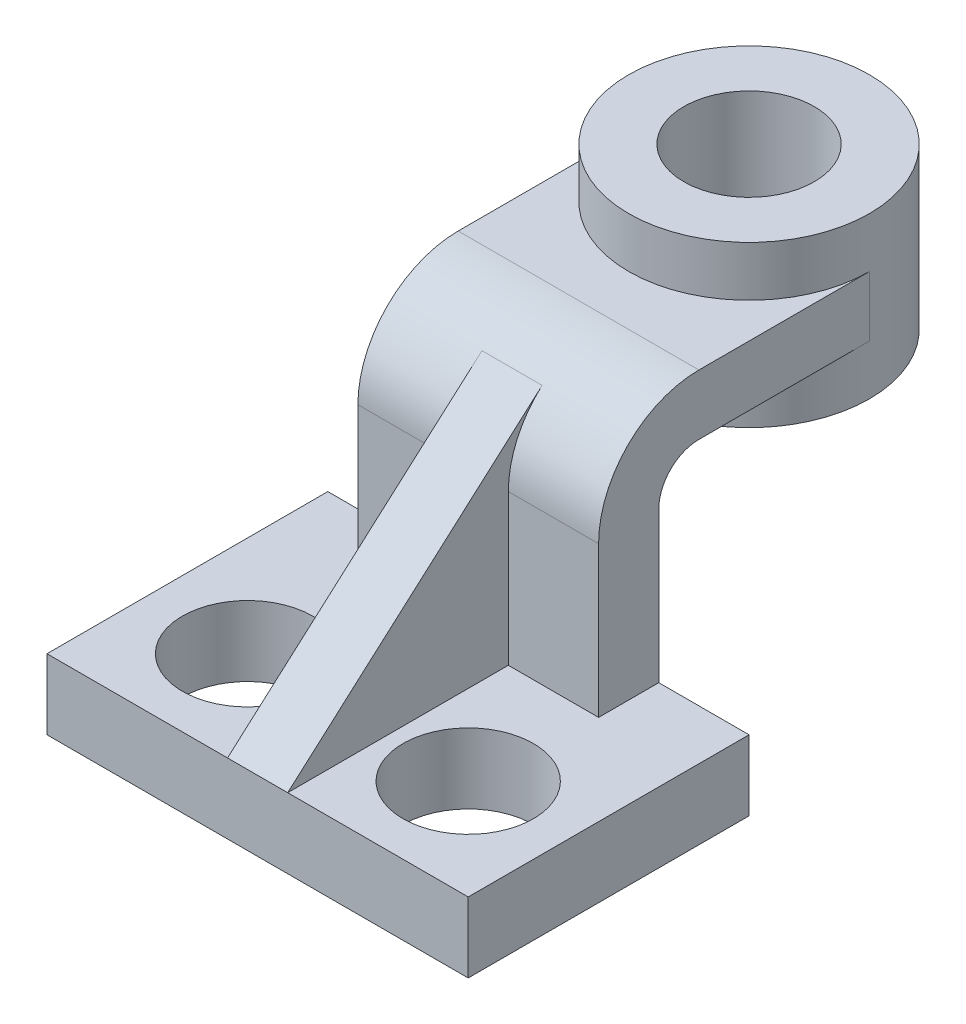
ISO-10303-21;
HEADER;
FILE_DESCRIPTION(('STEP AP214'),'2;1');
FILE_NAME('part.step','',(''),(''),'','','');
FILE_SCHEMA(('AUTOMOTIVE_DESIGN { 1 0 10303 214 1 1 1 1 }'));
ENDSEC;
DATA;
#1=APPLICATION_CONTEXT('core data for automotive mechanical design processes');
#2=APPLICATION_PROTOCOL_DEFINITION('international standard','automotive_design',2000,#1);
#3=PRODUCT_CONTEXT('',#1,'mechanical');
#4=PRODUCT('Part','Part','',(#3));
#5=PRODUCT_RELATED_PRODUCT_CATEGORY('part','',(#4));
#6=PRODUCT_DEFINITION_FORMATION('','',#4);
#7=PRODUCT_DEFINITION_CONTEXT('part definition',#1,'design');
#8=PRODUCT_DEFINITION('design','',#6,#7);
#9=PRODUCT_DEFINITION_SHAPE('','',#8);
#10=(LENGTH_UNIT() NAMED_UNIT(*) SI_UNIT(.MILLI.,.METRE.));
#11=(NAMED_UNIT(*) PLANE_ANGLE_UNIT() SI_UNIT($,.RADIAN.));
#12=(NAMED_UNIT(*) SI_UNIT($,.STERADIAN.) SOLID_ANGLE_UNIT());
#13=UNCERTAINTY_MEASURE_WITH_UNIT(LENGTH_MEASURE(1.E-05),#10,'distance_accuracy_value','');
#14=(GEOMETRIC_REPRESENTATION_CONTEXT(3) GLOBAL_UNCERTAINTY_ASSIGNED_CONTEXT((#13)) GLOBAL_UNIT_ASSIGNED_CONTEXT((#10,
#11,#12)) REPRESENTATION_CONTEXT('',''));
#15=CARTESIAN_POINT('',(0.,0.,0.));
#16=DIRECTION('',(0.,0.,1.));
#17=DIRECTION('',(1.,0.,0.));
#18=AXIS2_PLACEMENT_3D('',#15,#16,#17);
#19=CARTESIAN_POINT('',(-9.00000000000001,7.,-22.));
#20=DIRECTION('',(0.,0.,-1.));
#21=DIRECTION('',(-1.,0.,0.));
#22=AXIS2_PLACEMENT_3D('',#19,#20,#21);
#23=PLANE('',#22);
#24=DIRECTION('',(0.,-1.,0.));
#25=VECTOR('',#24,1.);
#26=CARTESIAN_POINT('',(-24.,7.,-22.));
#27=LINE('',#26,#25);
#28=CARTESIAN_POINT('',(-24.,21.9999999999999,-22.));
#29=VERTEX_POINT('',#28);
#30=CARTESIAN_POINT('',(-24.,7.,-22.));
#31=VERTEX_POINT('',#30);
#32=EDGE_CURVE('E63',#29,#31,#27,.T.);
#33=ORIENTED_EDGE('',*,*,#32,.F.);
#34=DIRECTION('',(-1.,0.,0.));
#35=VECTOR('',#34,1.);
#36=CARTESIAN_POINT('',(-9.00000000000001,21.9999999999999,-22.));
#37=LINE('',#36,#35);
#38=CARTESIAN_POINT('',(-33.,21.9999999999999,-22.));
#39=VERTEX_POINT('',#38);
#40=EDGE_CURVE('E136',#29,#39,#37,.T.);
#41=ORIENTED_EDGE('',*,*,#40,.T.);
#42=DIRECTION('',(0.,-1.,0.));
#43=VECTOR('',#42,1.);
#44=CARTESIAN_POINT('',(-33.,7.,-22.));
#45=LINE('',#44,#43);
#46=CARTESIAN_POINT('',(-33.,7.,-22.));
#47=VERTEX_POINT('',#46);
#48=EDGE_CURVE('E141',#39,#47,#45,.T.);
#49=ORIENTED_EDGE('',*,*,#48,.T.);
#50=DIRECTION('',(-1.,0.,0.));
#51=VECTOR('',#50,1.);
#52=CARTESIAN_POINT('',(-9.00000000000001,7.,-22.));
#53=LINE('',#52,#51);
#54=EDGE_CURVE('E187',#31,#47,#53,.T.);
#55=ORIENTED_EDGE('',*,*,#54,.F.);
#56=EDGE_LOOP('',(#33,#41,#49,#55));
#57=FACE_BOUND('',#56,.T.);
#58=ADVANCED_FACE('F45',(#57),#23,.F.);
#59=CARTESIAN_POINT('',(-42.,7.,0.));
#60=DIRECTION('',(0.,1.,0.));
#61=DIRECTION('',(0.,0.,1.));
#62=AXIS2_PLACEMENT_3D('',#59,#60,#61);
#63=PLANE('',#62);
#64=CARTESIAN_POINT('',(-32.,7.,-10.));
#65=DIRECTION('',(0.,1.,0.));
#66=DIRECTION('',(0.,0.,-1.));
#67=AXIS2_PLACEMENT_3D('',#64,#65,#66);
#68=CIRCLE('',#67,6.5);
#69=CARTESIAN_POINT('',(-32.,7.,-16.5));
#70=VERTEX_POINT('',#69);
#71=EDGE_CURVE('E314',#70,#70,#68,.T.);
#72=ORIENTED_EDGE('',*,*,#71,.F.);
#73=EDGE_LOOP('',(#72));
#74=FACE_BOUND('',#73,.T.);
#75=DIRECTION('',(1.,0.,0.));
#76=VECTOR('',#75,1.);
#77=CARTESIAN_POINT('',(-42.,7.,0.));
#78=LINE('',#77,#76);
#79=CARTESIAN_POINT('',(-42.,7.,0.));
#80=VERTEX_POINT('',#79);
#81=CARTESIAN_POINT('',(-24.,7.,0.));
#82=VERTEX_POINT('',#81);
#83=EDGE_CURVE('E231',#80,#82,#78,.T.);
#84=ORIENTED_EDGE('',*,*,#83,.T.);
#85=DIRECTION('',(0.,0.,-1.));
#86=VECTOR('',#85,1.);
#87=CARTESIAN_POINT('',(-24.,7.,-25.3670653506778));
#88=LINE('',#87,#86);
#89=EDGE_CURVE('E300',#82,#31,#88,.T.);
#90=ORIENTED_EDGE('',*,*,#89,.T.);
#91=ORIENTED_EDGE('',*,*,#54,.T.);
#92=DIRECTION('',(0.,0.,-1.));
#93=VECTOR('',#92,1.);
#94=CARTESIAN_POINT('',(-33.,7.,-28.));
#95=LINE('',#94,#93);
#96=CARTESIAN_POINT('',(-33.,7.,-28.));
#97=VERTEX_POINT('',#96);
#98=EDGE_CURVE('E145',#47,#97,#95,.T.);
#99=ORIENTED_EDGE('',*,*,#98,.T.);
#100=DIRECTION('',(1.,0.,0.));
#101=VECTOR('',#100,1.);
#102=CARTESIAN_POINT('',(-42.,7.,-28.));
#103=LINE('',#102,#101);
#104=CARTESIAN_POINT('',(-42.,7.,-28.));
#105=VERTEX_POINT('',#104);
#106=EDGE_CURVE('E235',#105,#97,#103,.T.);
#107=ORIENTED_EDGE('',*,*,#106,.F.);
#108=DIRECTION('',(0.,0.,1.));
#109=VECTOR('',#108,1.);
#110=CARTESIAN_POINT('',(-42.,7.,0.));
#111=LINE('',#110,#109);
#112=EDGE_CURVE('E212',#105,#80,#111,.T.);
#113=ORIENTED_EDGE('',*,*,#112,.T.);
#114=EDGE_LOOP('',(#84,#90,#91,#99,#107,#113));
#115=FACE_BOUND('',#114,.T.);
#116=ADVANCED_FACE('F343',(#74,#115),#63,.T.);
#117=CARTESIAN_POINT('',(-42.,0.,0.));
#118=DIRECTION('',(0.,0.,1.));
#119=DIRECTION('',(1.,0.,0.));
#120=AXIS2_PLACEMENT_3D('',#117,#118,#119);
#121=PLANE('',#120);
#122=DIRECTION('',(0.,-1.,0.));
#123=VECTOR('',#122,1.);
#124=CARTESIAN_POINT('',(0.,0.,0.));
#125=LINE('',#124,#123);
#126=CARTESIAN_POINT('',(0.,7.,0.));
#127=VERTEX_POINT('',#126);
#128=CARTESIAN_POINT('',(0.,0.,0.));
#129=VERTEX_POINT('',#128);
#130=EDGE_CURVE('E198',#127,#129,#125,.T.);
#131=ORIENTED_EDGE('',*,*,#130,.F.);
#132=CARTESIAN_POINT('',(-18.,7.,0.));
#133=VERTEX_POINT('',#132);
#134=EDGE_CURVE('E236',#133,#127,#78,.T.);
#135=ORIENTED_EDGE('',*,*,#134,.F.);
#136=DIRECTION('',(-1.,0.,0.));
#137=VECTOR('',#136,1.);
#138=CARTESIAN_POINT('',(-18.,7.,0.));
#139=LINE('',#138,#137);
#140=EDGE_CURVE('E290',#133,#82,#139,.T.);
#141=ORIENTED_EDGE('',*,*,#140,.T.);
#142=ORIENTED_EDGE('',*,*,#83,.F.);
#143=DIRECTION('',(0.,-1.,0.));
#144=VECTOR('',#143,1.);
#145=CARTESIAN_POINT('',(-42.,0.,0.));
#146=LINE('',#145,#144);
#147=CARTESIAN_POINT('',(-42.,0.,0.));
#148=VERTEX_POINT('',#147);
#149=EDGE_CURVE('E199',#80,#148,#146,.T.);
#150=ORIENTED_EDGE('',*,*,#149,.T.);
#151=DIRECTION('',(1.,0.,0.));
#152=VECTOR('',#151,1.);
#153=CARTESIAN_POINT('',(-42.,0.,0.));
#154=LINE('',#153,#152);
#155=EDGE_CURVE('E216',#148,#129,#154,.T.);
#156=ORIENTED_EDGE('',*,*,#155,.T.);
#157=EDGE_LOOP('',(#131,#135,#141,#142,#150,#156));
#158=FACE_BOUND('',#157,.T.);
#159=ADVANCED_FACE('F360',(#158),#121,.T.);
#160=CARTESIAN_POINT('',(-42.,0.,0.));
#161=DIRECTION('',(-1.,0.,0.));
#162=DIRECTION('',(0.,0.,1.));
#163=AXIS2_PLACEMENT_3D('',#160,#161,#162);
#164=PLANE('',#163);
#165=ORIENTED_EDGE('',*,*,#149,.F.);
#166=ORIENTED_EDGE('',*,*,#112,.F.);
#167=DIRECTION('',(0.,1.,0.));
#168=VECTOR('',#167,1.);
#169=CARTESIAN_POINT('',(-42.,0.,-28.));
#170=LINE('',#169,#168);
#171=CARTESIAN_POINT('',(-42.,0.,-28.));
#172=VERTEX_POINT('',#171);
#173=EDGE_CURVE('E208',#172,#105,#170,.T.);
#174=ORIENTED_EDGE('',*,*,#173,.F.);
#175=DIRECTION('',(0.,0.,-1.));
#176=VECTOR('',#175,1.);
#177=CARTESIAN_POINT('',(-42.,0.,0.));
#178=LINE('',#177,#176);
#179=EDGE_CURVE('E204',#148,#172,#178,.T.);
#180=ORIENTED_EDGE('',*,*,#179,.F.);
#181=EDGE_LOOP('',(#165,#166,#174,#180));
#182=FACE_BOUND('',#181,.T.);
#183=ADVANCED_FACE('F412',(#182),#164,.T.);
#184=CARTESIAN_POINT('',(-42.,0.,0.));
#185=DIRECTION('',(0.,-1.,0.));
#186=DIRECTION('',(0.,0.,-1.));
#187=AXIS2_PLACEMENT_3D('',#184,#185,#186);
#188=PLANE('',#187);
#189=CARTESIAN_POINT('',(-10.,0.,-10.));
#190=DIRECTION('',(0.,1.,0.));
#191=DIRECTION('',(0.,0.,1.));
#192=AXIS2_PLACEMENT_3D('',#189,#190,#191);
#193=CIRCLE('',#192,6.5);
#194=CARTESIAN_POINT('',(-10.,0.,-3.50000000000001));
#195=VERTEX_POINT('',#194);
#196=EDGE_CURVE('E303',#195,#195,#193,.T.);
#197=ORIENTED_EDGE('',*,*,#196,.T.);
#198=EDGE_LOOP('',(#197));
#199=FACE_BOUND('',#198,.T.);
#200=CARTESIAN_POINT('',(-32.,0.,-10.));
#201=DIRECTION('',(0.,1.,0.));
#202=DIRECTION('',(0.,0.,-1.));
#203=AXIS2_PLACEMENT_3D('',#200,#201,#202);
#204=CIRCLE('',#203,6.5);
#205=CARTESIAN_POINT('',(-32.,0.,-16.5));
#206=VERTEX_POINT('',#205);
#207=EDGE_CURVE('E310',#206,#206,#204,.T.);
#208=ORIENTED_EDGE('',*,*,#207,.T.);
#209=EDGE_LOOP('',(#208));
#210=FACE_BOUND('',#209,.T.);
#211=DIRECTION('',(0.,0.,-1.));
#212=VECTOR('',#211,1.);
#213=CARTESIAN_POINT('',(0.,0.,0.));
#214=LINE('',#213,#212);
#215=CARTESIAN_POINT('',(0.,0.,-28.));
#216=VERTEX_POINT('',#215);
#217=EDGE_CURVE('E220',#129,#216,#214,.T.);
#218=ORIENTED_EDGE('',*,*,#217,.F.);
#219=ORIENTED_EDGE('',*,*,#155,.F.);
#220=ORIENTED_EDGE('',*,*,#179,.T.);
#221=DIRECTION('',(1.,0.,0.));
#222=VECTOR('',#221,1.);
#223=CARTESIAN_POINT('',(-42.,0.,-28.));
#224=LINE('',#223,#222);
#225=EDGE_CURVE('E240',#172,#216,#224,.T.);
#226=ORIENTED_EDGE('',*,*,#225,.T.);
#227=EDGE_LOOP('',(#218,#219,#220,#226));
#228=FACE_BOUND('',#227,.T.);
#229=ADVANCED_FACE('F326',(#199,#210,#228),#188,.T.);
#230=CARTESIAN_POINT('',(0.,0.,0.));
#231=DIRECTION('',(-1.,0.,0.));
#232=DIRECTION('',(0.,0.,1.));
#233=AXIS2_PLACEMENT_3D('',#230,#231,#232);
#234=PLANE('',#233);
#235=ORIENTED_EDGE('',*,*,#130,.T.);
#236=ORIENTED_EDGE('',*,*,#217,.T.);
#237=DIRECTION('',(0.,1.,0.));
#238=VECTOR('',#237,1.);
#239=CARTESIAN_POINT('',(0.,0.,-28.));
#240=LINE('',#239,#238);
#241=CARTESIAN_POINT('',(0.,7.,-28.));
#242=VERTEX_POINT('',#241);
#243=EDGE_CURVE('E224',#216,#242,#240,.T.);
#244=ORIENTED_EDGE('',*,*,#243,.T.);
#245=DIRECTION('',(0.,0.,1.));
#246=VECTOR('',#245,1.);
#247=CARTESIAN_POINT('',(0.,7.,0.));
#248=LINE('',#247,#246);
#249=EDGE_CURVE('E203',#242,#127,#248,.T.);
#250=ORIENTED_EDGE('',*,*,#249,.T.);
#251=EDGE_LOOP('',(#235,#236,#244,#250));
#252=FACE_BOUND('',#251,.T.);
#253=ADVANCED_FACE('F462',(#252),#234,.F.);
#254=CARTESIAN_POINT('',(-9.00000000000001,22.,-32.));
#255=DIRECTION('',(-1.,0.,0.));
#256=DIRECTION('',(0.,0.,1.));
#257=AXIS2_PLACEMENT_3D('',#254,#255,#256);
#258=CYLINDRICAL_SURFACE('',#257,4.);
#259=CARTESIAN_POINT('',(-33.,22.,-32.));
#260=DIRECTION('',(-1.,0.,0.));
#261=DIRECTION('',(0.,0.,1.));
#262=AXIS2_PLACEMENT_3D('',#259,#260,#261);
#263=CIRCLE('',#262,4.);
#264=CARTESIAN_POINT('',(-33.,22.,-28.));
#265=VERTEX_POINT('',#264);
#266=CARTESIAN_POINT('',(-33.,26.,-32.));
#267=VERTEX_POINT('',#266);
#268=EDGE_CURVE('E55',#265,#267,#263,.T.);
#269=ORIENTED_EDGE('',*,*,#268,.T.);
#270=DIRECTION('',(-1.,0.,0.));
#271=VECTOR('',#270,1.);
#272=CARTESIAN_POINT('',(-9.00000000000001,26.,-32.));
#273=LINE('',#272,#271);
#274=CARTESIAN_POINT('',(-9.00000000000001,26.,-32.));
#275=VERTEX_POINT('',#274);
#276=EDGE_CURVE('E137',#275,#267,#273,.T.);
#277=ORIENTED_EDGE('',*,*,#276,.F.);
#278=CARTESIAN_POINT('',(-9.00000000000001,22.,-32.));
#279=DIRECTION('',(-1.,0.,0.));
#280=DIRECTION('',(0.,0.,1.));
#281=AXIS2_PLACEMENT_3D('',#278,#279,#280);
#282=CIRCLE('',#281,4.);
#283=CARTESIAN_POINT('',(-9.00000000000001,22.,-28.));
#284=VERTEX_POINT('',#283);
#285=EDGE_CURVE('E97',#284,#275,#282,.T.);
#286=ORIENTED_EDGE('',*,*,#285,.F.);
#287=DIRECTION('',(-1.,0.,0.));
#288=VECTOR('',#287,1.);
#289=CARTESIAN_POINT('',(-9.00000000000001,22.,-28.));
#290=LINE('',#289,#288);
#291=EDGE_CURVE('E195',#284,#265,#290,.T.);
#292=ORIENTED_EDGE('',*,*,#291,.T.);
#293=EDGE_LOOP('',(#269,#277,#286,#292));
#294=FACE_BOUND('',#293,.T.);
#295=ADVANCED_FACE('F452',(#294),#258,.F.);
#296=CARTESIAN_POINT('',(-9.00000000000001,26.,-32.));
#297=DIRECTION('',(0.,1.,0.));
#298=DIRECTION('',(0.,0.,1.));
#299=AXIS2_PLACEMENT_3D('',#296,#297,#298);
#300=PLANE('',#299);
#301=DIRECTION('',(0.,0.,-1.));
#302=VECTOR('',#301,1.);
#303=CARTESIAN_POINT('',(-33.,26.,-32.));
#304=LINE('',#303,#302);
#305=CARTESIAN_POINT('',(-33.,26.,-49.));
#306=VERTEX_POINT('',#305);
#307=EDGE_CURVE('E124',#267,#306,#304,.T.);
#308=ORIENTED_EDGE('',*,*,#307,.T.);
#309=CARTESIAN_POINT('',(-21.,26.,-49.));
#310=DIRECTION('',(0.,1.,0.));
#311=DIRECTION('',(0.,0.,1.));
#312=AXIS2_PLACEMENT_3D('',#309,#310,#311);
#313=CIRCLE('',#312,12.);
#314=CARTESIAN_POINT('',(-9.00000000000001,26.,-49.));
#315=VERTEX_POINT('',#314);
#316=EDGE_CURVE('E249',#306,#315,#313,.T.);
#317=ORIENTED_EDGE('',*,*,#316,.T.);
#318=DIRECTION('',(0.,0.,-1.));
#319=VECTOR('',#318,1.);
#320=CARTESIAN_POINT('',(-9.00000000000001,26.,-32.));
#321=LINE('',#320,#319);
#322=EDGE_CURVE('E170',#275,#315,#321,.T.);
#323=ORIENTED_EDGE('',*,*,#322,.F.);
#324=ORIENTED_EDGE('',*,*,#276,.T.);
#325=EDGE_LOOP('',(#308,#317,#323,#324));
#326=FACE_BOUND('',#325,.T.);
#327=ADVANCED_FACE('F451',(#326),#300,.F.);
#328=CARTESIAN_POINT('',(-9.00000000000001,32.,-32.0000000000001));
#329=DIRECTION('',(0.,-1.,0.));
#330=DIRECTION('',(0.,0.,-1.));
#331=AXIS2_PLACEMENT_3D('',#328,#329,#330);
#332=PLANE('',#331);
#333=DIRECTION('',(0.,0.,1.));
#334=VECTOR('',#333,1.);
#335=CARTESIAN_POINT('',(-9.00000000000001,32.,-32.0000000000001));
#336=LINE('',#335,#334);
#337=CARTESIAN_POINT('',(-9.00000000000001,32.,-49.));
#338=VERTEX_POINT('',#337);
#339=CARTESIAN_POINT('',(-9.00000000000001,32.,-32.0000000000001));
#340=VERTEX_POINT('',#339);
#341=EDGE_CURVE('E163',#338,#340,#336,.T.);
#342=ORIENTED_EDGE('',*,*,#341,.F.);
#343=CARTESIAN_POINT('',(-21.,32.,-49.));
#344=DIRECTION('',(0.,-1.,0.));
#345=DIRECTION('',(0.,0.,-1.));
#346=AXIS2_PLACEMENT_3D('',#343,#344,#345);
#347=CIRCLE('',#346,12.);
#348=CARTESIAN_POINT('',(-33.,32.,-49.));
#349=VERTEX_POINT('',#348);
#350=EDGE_CURVE('E120',#338,#349,#347,.T.);
#351=ORIENTED_EDGE('',*,*,#350,.T.);
#352=DIRECTION('',(0.,0.,1.));
#353=VECTOR('',#352,1.);
#354=CARTESIAN_POINT('',(-33.,32.,-32.0000000000001));
#355=LINE('',#354,#353);
#356=CARTESIAN_POINT('',(-33.,32.,-32.0000000000001));
#357=VERTEX_POINT('',#356);
#358=EDGE_CURVE('E113',#349,#357,#355,.T.);
#359=ORIENTED_EDGE('',*,*,#358,.T.);
#360=DIRECTION('',(-1.,0.,0.));
#361=VECTOR('',#360,1.);
#362=CARTESIAN_POINT('',(-9.00000000000001,32.,-32.0000000000001));
#363=LINE('',#362,#361);
#364=EDGE_CURVE('E116',#340,#357,#363,.T.);
#365=ORIENTED_EDGE('',*,*,#364,.F.);
#366=EDGE_LOOP('',(#342,#351,#359,#365));
#367=FACE_BOUND('',#366,.T.);
#368=ADVANCED_FACE('F47',(#367),#332,.F.);
#369=CARTESIAN_POINT('',(-9.00000000000001,22.,-32.));
#370=DIRECTION('',(-1.,0.,0.));
#371=DIRECTION('',(0.,0.,1.));
#372=AXIS2_PLACEMENT_3D('',#369,#370,#371);
#373=CYLINDRICAL_SURFACE('',#372,10.);
#374=DIRECTION('',(-1.,0.,0.));
#375=VECTOR('',#374,1.);
#376=CARTESIAN_POINT('',(-18.,29.4835939185541,-25.3670653506778));
#377=LINE('',#376,#375);
#378=CARTESIAN_POINT('',(-18.,29.4835939185541,-25.3670653506778));
#379=VERTEX_POINT('',#378);
#380=CARTESIAN_POINT('',(-24.,29.4835939185541,-25.3670653506778));
#381=VERTEX_POINT('',#380);
#382=EDGE_CURVE('E286',#379,#381,#377,.T.);
#383=ORIENTED_EDGE('',*,*,#382,.F.);
#384=CARTESIAN_POINT('',(-18.,22.,-32.));
#385=DIRECTION('',(1.,0.,0.));
#386=DIRECTION('',(0.,0.,-1.));
#387=AXIS2_PLACEMENT_3D('',#384,#385,#386);
#388=CIRCLE('',#387,10.);
#389=CARTESIAN_POINT('',(-18.,21.9999999999999,-22.));
#390=VERTEX_POINT('',#389);
#391=EDGE_CURVE('E259',#379,#390,#388,.T.);
#392=ORIENTED_EDGE('',*,*,#391,.T.);
#393=CARTESIAN_POINT('',(-9.00000000000001,21.9999999999999,-22.));
#394=VERTEX_POINT('',#393);
#395=EDGE_CURVE('E188',#394,#390,#37,.T.);
#396=ORIENTED_EDGE('',*,*,#395,.F.);
#397=CARTESIAN_POINT('',(-9.00000000000001,22.,-32.));
#398=DIRECTION('',(1.,0.,0.));
#399=DIRECTION('',(0.,0.,1.));
#400=AXIS2_PLACEMENT_3D('',#397,#398,#399);
#401=CIRCLE('',#400,10.);
#402=EDGE_CURVE('E134',#340,#394,#401,.T.);
#403=ORIENTED_EDGE('',*,*,#402,.F.);
#404=ORIENTED_EDGE('',*,*,#364,.T.);
#405=CARTESIAN_POINT('',(-33.,22.,-32.));
#406=DIRECTION('',(1.,0.,0.));
#407=DIRECTION('',(0.,0.,1.));
#408=AXIS2_PLACEMENT_3D('',#405,#406,#407);
#409=CIRCLE('',#408,10.);
#410=EDGE_CURVE('E125',#357,#39,#409,.T.);
#411=ORIENTED_EDGE('',*,*,#410,.T.);
#412=ORIENTED_EDGE('',*,*,#40,.F.);
#413=CARTESIAN_POINT('',(-24.,22.,-32.));
#414=DIRECTION('',(1.,0.,0.));
#415=DIRECTION('',(0.,0.,-1.));
#416=AXIS2_PLACEMENT_3D('',#413,#414,#415);
#417=CIRCLE('',#416,10.);
#418=EDGE_CURVE('E281',#381,#29,#417,.T.);
#419=ORIENTED_EDGE('',*,*,#418,.F.);
#420=EDGE_LOOP('',(#383,#392,#396,#403,#404,#411,#412,#419));
#421=FACE_BOUND('',#420,.T.);
#422=ADVANCED_FACE('F130',(#421),#373,.T.);
#423=ORIENTED_EDGE('',*,*,#395,.T.);
#424=DIRECTION('',(0.,-1.,0.));
#425=VECTOR('',#424,1.);
#426=CARTESIAN_POINT('',(-18.,7.,-22.));
#427=LINE('',#426,#425);
#428=CARTESIAN_POINT('',(-18.,7.,-22.));
#429=VERTEX_POINT('',#428);
#430=EDGE_CURVE('E277',#390,#429,#427,.T.);
#431=ORIENTED_EDGE('',*,*,#430,.T.);
#432=CARTESIAN_POINT('',(-9.00000000000001,7.,-22.));
#433=VERTEX_POINT('',#432);
#434=EDGE_CURVE('E158',#433,#429,#53,.T.);
#435=ORIENTED_EDGE('',*,*,#434,.F.);
#436=DIRECTION('',(0.,-1.,0.));
#437=VECTOR('',#436,1.);
#438=CARTESIAN_POINT('',(-9.00000000000001,7.,-22.));
#439=LINE('',#438,#437);
#440=EDGE_CURVE('E157',#394,#433,#439,.T.);
#441=ORIENTED_EDGE('',*,*,#440,.F.);
#442=EDGE_LOOP('',(#423,#431,#435,#441));
#443=FACE_BOUND('',#442,.T.);
#444=ADVANCED_FACE('F341',(#443),#23,.F.);
#445=CARTESIAN_POINT('',(-10.,7.,-10.));
#446=DIRECTION('',(0.,1.,0.));
#447=DIRECTION('',(0.,0.,1.));
#448=AXIS2_PLACEMENT_3D('',#445,#446,#447);
#449=CIRCLE('',#448,6.5);
#450=CARTESIAN_POINT('',(-10.,7.,-3.50000000000001));
#451=VERTEX_POINT('',#450);
#452=EDGE_CURVE('E318',#451,#451,#449,.T.);
#453=ORIENTED_EDGE('',*,*,#452,.F.);
#454=EDGE_LOOP('',(#453));
#455=FACE_BOUND('',#454,.T.);
#456=DIRECTION('',(0.,0.,-1.));
#457=VECTOR('',#456,1.);
#458=CARTESIAN_POINT('',(-18.,7.,-25.3670653506778));
#459=LINE('',#458,#457);
#460=EDGE_CURVE('E299',#133,#429,#459,.T.);
#461=ORIENTED_EDGE('',*,*,#460,.F.);
#462=ORIENTED_EDGE('',*,*,#134,.T.);
#463=ORIENTED_EDGE('',*,*,#249,.F.);
#464=CARTESIAN_POINT('',(-9.00000000000001,7.,-28.));
#465=VERTEX_POINT('',#464);
#466=EDGE_CURVE('E239',#465,#242,#103,.T.);
#467=ORIENTED_EDGE('',*,*,#466,.F.);
#468=DIRECTION('',(0.,0.,-1.));
#469=VECTOR('',#468,1.);
#470=CARTESIAN_POINT('',(-9.00000000000001,7.,-28.));
#471=LINE('',#470,#469);
#472=EDGE_CURVE('E154',#433,#465,#471,.T.);
#473=ORIENTED_EDGE('',*,*,#472,.F.);
#474=ORIENTED_EDGE('',*,*,#434,.T.);
#475=EDGE_LOOP('',(#461,#462,#463,#467,#473,#474));
#476=FACE_BOUND('',#475,.T.);
#477=ADVANCED_FACE('F337',(#455,#476),#63,.T.);
#478=CARTESIAN_POINT('',(-42.,0.,-28.));
#479=DIRECTION('',(0.,0.,-1.));
#480=DIRECTION('',(-1.,0.,0.));
#481=AXIS2_PLACEMENT_3D('',#478,#479,#480);
#482=PLANE('',#481);
#483=ORIENTED_EDGE('',*,*,#243,.F.);
#484=ORIENTED_EDGE('',*,*,#225,.F.);
#485=ORIENTED_EDGE('',*,*,#173,.T.);
#486=ORIENTED_EDGE('',*,*,#106,.T.);
#487=DIRECTION('',(0.,1.,0.));
#488=VECTOR('',#487,1.);
#489=CARTESIAN_POINT('',(-33.,7.,-28.));
#490=LINE('',#489,#488);
#491=EDGE_CURVE('E11',#97,#265,#490,.T.);
#492=ORIENTED_EDGE('',*,*,#491,.T.);
#493=ORIENTED_EDGE('',*,*,#291,.F.);
#494=DIRECTION('',(0.,1.,0.));
#495=VECTOR('',#494,1.);
#496=CARTESIAN_POINT('',(-9.00000000000001,7.,-28.));
#497=LINE('',#496,#495);
#498=EDGE_CURVE('E49',#465,#284,#497,.T.);
#499=ORIENTED_EDGE('',*,*,#498,.F.);
#500=ORIENTED_EDGE('',*,*,#466,.T.);
#501=EDGE_LOOP('',(#483,#484,#485,#486,#492,#493,#499,#500));
#502=FACE_BOUND('',#501,.T.);
#503=ADVANCED_FACE('F340',(#502),#482,.T.);
#504=CARTESIAN_POINT('',(-33.,22.,-32.));
#505=DIRECTION('',(-1.,0.,0.));
#506=DIRECTION('',(0.,0.,1.));
#507=AXIS2_PLACEMENT_3D('',#504,#505,#506);
#508=PLANE('',#507);
#509=ORIENTED_EDGE('',*,*,#491,.F.);
#510=ORIENTED_EDGE('',*,*,#98,.F.);
#511=ORIENTED_EDGE('',*,*,#48,.F.);
#512=ORIENTED_EDGE('',*,*,#410,.F.);
#513=ORIENTED_EDGE('',*,*,#358,.F.);
#514=DIRECTION('',(0.,1.,0.));
#515=VECTOR('',#514,1.);
#516=CARTESIAN_POINT('',(-33.,26.,-49.));
#517=LINE('',#516,#515);
#518=EDGE_CURVE('E254',#306,#349,#517,.T.);
#519=ORIENTED_EDGE('',*,*,#518,.F.);
#520=ORIENTED_EDGE('',*,*,#307,.F.);
#521=ORIENTED_EDGE('',*,*,#268,.F.);
#522=EDGE_LOOP('',(#509,#510,#511,#512,#513,#519,#520,#521));
#523=FACE_BOUND('',#522,.T.);
#524=ADVANCED_FACE('F139',(#523),#508,.T.);
#525=CARTESIAN_POINT('',(-9.00000000000001,22.,-32.));
#526=DIRECTION('',(-1.,0.,0.));
#527=DIRECTION('',(0.,0.,1.));
#528=AXIS2_PLACEMENT_3D('',#525,#526,#527);
#529=PLANE('',#528);
#530=ORIENTED_EDGE('',*,*,#498,.T.);
#531=ORIENTED_EDGE('',*,*,#285,.T.);
#532=ORIENTED_EDGE('',*,*,#322,.T.);
#533=DIRECTION('',(0.,1.,0.));
#534=VECTOR('',#533,1.);
#535=CARTESIAN_POINT('',(-9.00000000000001,26.,-49.));
#536=LINE('',#535,#534);
#537=EDGE_CURVE('E166',#315,#338,#536,.T.);
#538=ORIENTED_EDGE('',*,*,#537,.T.);
#539=ORIENTED_EDGE('',*,*,#341,.T.);
#540=ORIENTED_EDGE('',*,*,#402,.T.);
#541=ORIENTED_EDGE('',*,*,#440,.T.);
#542=ORIENTED_EDGE('',*,*,#472,.T.);
#543=EDGE_LOOP('',(#530,#531,#532,#538,#539,#540,#541,#542));
#544=FACE_BOUND('',#543,.T.);
#545=ADVANCED_FACE('F438',(#544),#529,.F.);
#546=CARTESIAN_POINT('',(-21.,21.,-49.));
#547=DIRECTION('',(0.,1.,0.));
#548=DIRECTION('',(0.,0.,1.));
#549=AXIS2_PLACEMENT_3D('',#546,#547,#548);
#550=PLANE('',#549);
#551=CARTESIAN_POINT('',(-21.,21.,-49.));
#552=DIRECTION('',(0.,1.,0.));
#553=DIRECTION('',(0.,0.,1.));
#554=AXIS2_PLACEMENT_3D('',#551,#552,#553);
#555=CIRCLE('',#554,6.5);
#556=CARTESIAN_POINT('',(-21.,21.,-42.5));
#557=VERTEX_POINT('',#556);
#558=EDGE_CURVE('E267',#557,#557,#555,.T.);
#559=ORIENTED_EDGE('',*,*,#558,.T.);
#560=EDGE_LOOP('',(#559));
#561=FACE_BOUND('',#560,.T.);
#562=CARTESIAN_POINT('',(-21.,21.,-49.));
#563=DIRECTION('',(0.,1.,0.));
#564=DIRECTION('',(0.,0.,1.));
#565=AXIS2_PLACEMENT_3D('',#562,#563,#564);
#566=CIRCLE('',#565,12.);
#567=CARTESIAN_POINT('',(-21.,21.,-37.));
#568=VERTEX_POINT('',#567);
#569=EDGE_CURVE('E258',#568,#568,#566,.T.);
#570=ORIENTED_EDGE('',*,*,#569,.F.);
#571=EDGE_LOOP('',(#570));
#572=FACE_BOUND('',#571,.T.);
#573=ADVANCED_FACE('F429',(#561,#572),#550,.F.);
#574=CARTESIAN_POINT('',(-21.,37.,-49.));
#575=DIRECTION('',(0.,1.,0.));
#576=DIRECTION('',(0.,0.,1.));
#577=AXIS2_PLACEMENT_3D('',#574,#575,#576);
#578=PLANE('',#577);
#579=CARTESIAN_POINT('',(-21.,37.,-49.));
#580=DIRECTION('',(0.,1.,0.));
#581=DIRECTION('',(0.,0.,1.));
#582=AXIS2_PLACEMENT_3D('',#579,#580,#581);
#583=CIRCLE('',#582,12.);
#584=CARTESIAN_POINT('',(-21.,37.,-37.));
#585=VERTEX_POINT('',#584);
#586=EDGE_CURVE('E263',#585,#585,#583,.T.);
#587=ORIENTED_EDGE('',*,*,#586,.T.);
#588=EDGE_LOOP('',(#587));
#589=FACE_BOUND('',#588,.T.);
#590=CARTESIAN_POINT('',(-21.,37.,-49.));
#591=DIRECTION('',(0.,1.,0.));
#592=DIRECTION('',(0.,0.,1.));
#593=AXIS2_PLACEMENT_3D('',#590,#591,#592);
#594=CIRCLE('',#593,6.5);
#595=CARTESIAN_POINT('',(-21.,37.,-42.5));
#596=VERTEX_POINT('',#595);
#597=EDGE_CURVE('E253',#596,#596,#594,.T.);
#598=ORIENTED_EDGE('',*,*,#597,.F.);
#599=EDGE_LOOP('',(#598));
#600=FACE_BOUND('',#599,.T.);
#601=ADVANCED_FACE('F479',(#589,#600),#578,.T.);
#602=CARTESIAN_POINT('',(-21.,21.,-49.));
#603=DIRECTION('',(0.,1.,0.));
#604=DIRECTION('',(0.,0.,1.));
#605=AXIS2_PLACEMENT_3D('',#602,#603,#604);
#606=CYLINDRICAL_SURFACE('',#605,12.);
#607=ORIENTED_EDGE('',*,*,#586,.F.);
#608=EDGE_LOOP('',(#607));
#609=FACE_BOUND('',#608,.T.);
#610=ORIENTED_EDGE('',*,*,#569,.T.);
#611=EDGE_LOOP('',(#610));
#612=FACE_BOUND('',#611,.T.);
#613=ORIENTED_EDGE('',*,*,#316,.F.);
#614=ORIENTED_EDGE('',*,*,#518,.T.);
#615=ORIENTED_EDGE('',*,*,#350,.F.);
#616=ORIENTED_EDGE('',*,*,#537,.F.);
#617=EDGE_LOOP('',(#613,#614,#615,#616));
#618=FACE_BOUND('',#617,.T.);
#619=ADVANCED_FACE('F449',(#609,#612,#618),#606,.T.);
#620=CARTESIAN_POINT('',(-21.,21.,-49.));
#621=DIRECTION('',(0.,1.,0.));
#622=DIRECTION('',(0.,0.,1.));
#623=AXIS2_PLACEMENT_3D('',#620,#621,#622);
#624=CYLINDRICAL_SURFACE('',#623,6.5);
#625=ORIENTED_EDGE('',*,*,#558,.F.);
#626=EDGE_LOOP('',(#625));
#627=FACE_BOUND('',#626,.T.);
#628=ORIENTED_EDGE('',*,*,#597,.T.);
#629=EDGE_LOOP('',(#628));
#630=FACE_BOUND('',#629,.T.);
#631=ADVANCED_FACE('F427',(#627,#630),#624,.F.);
#632=CARTESIAN_POINT('',(-18.,0.,0.));
#633=DIRECTION('',(1.,0.,0.));
#634=DIRECTION('',(0.,0.,-1.));
#635=AXIS2_PLACEMENT_3D('',#632,#633,#634);
#636=PLANE('',#635);
#637=ORIENTED_EDGE('',*,*,#391,.F.);
#638=DIRECTION('',(0.,-0.663293464932225,0.748359391855413));
#639=VECTOR('',#638,1.);
#640=CARTESIAN_POINT('',(-18.,7.,0.));
#641=LINE('',#640,#639);
#642=EDGE_CURVE('E294',#379,#133,#641,.T.);
#643=ORIENTED_EDGE('',*,*,#642,.T.);
#644=ORIENTED_EDGE('',*,*,#460,.T.);
#645=ORIENTED_EDGE('',*,*,#430,.F.);
#646=EDGE_LOOP('',(#637,#643,#644,#645));
#647=FACE_BOUND('',#646,.T.);
#648=ADVANCED_FACE('F420',(#647),#636,.T.);
#649=CARTESIAN_POINT('',(-24.,0.,0.));
#650=DIRECTION('',(1.,0.,0.));
#651=DIRECTION('',(0.,0.,-1.));
#652=AXIS2_PLACEMENT_3D('',#649,#650,#651);
#653=PLANE('',#652);
#654=DIRECTION('',(0.,-0.663293464932225,0.748359391855413));
#655=VECTOR('',#654,1.);
#656=CARTESIAN_POINT('',(-24.,7.,0.));
#657=LINE('',#656,#655);
#658=EDGE_CURVE('E295',#381,#82,#657,.T.);
#659=ORIENTED_EDGE('',*,*,#658,.F.);
#660=ORIENTED_EDGE('',*,*,#418,.T.);
#661=ORIENTED_EDGE('',*,*,#32,.T.);
#662=ORIENTED_EDGE('',*,*,#89,.F.);
#663=EDGE_LOOP('',(#659,#660,#661,#662));
#664=FACE_BOUND('',#663,.T.);
#665=ADVANCED_FACE('F418',(#664),#653,.F.);
#666=CARTESIAN_POINT('',(-18.,7.,0.));
#667=DIRECTION('',(0.,-0.748359391855413,-0.663293464932225));
#668=DIRECTION('',(0.,0.663293464932225,-0.748359391855413));
#669=AXIS2_PLACEMENT_3D('',#666,#667,#668);
#670=PLANE('',#669);
#671=ORIENTED_EDGE('',*,*,#658,.T.);
#672=ORIENTED_EDGE('',*,*,#140,.F.);
#673=ORIENTED_EDGE('',*,*,#642,.F.);
#674=ORIENTED_EDGE('',*,*,#382,.T.);
#675=EDGE_LOOP('',(#671,#672,#673,#674));
#676=FACE_BOUND('',#675,.T.);
#677=ADVANCED_FACE('F333',(#676),#670,.F.);
#678=CARTESIAN_POINT('',(-10.,0.,-10.));
#679=DIRECTION('',(0.,1.,0.));
#680=DIRECTION('',(0.,0.,1.));
#681=AXIS2_PLACEMENT_3D('',#678,#679,#680);
#682=CYLINDRICAL_SURFACE('',#681,6.5);
#683=ORIENTED_EDGE('',*,*,#196,.F.);
#684=EDGE_LOOP('',(#683));
#685=FACE_BOUND('',#684,.T.);
#686=ORIENTED_EDGE('',*,*,#452,.T.);
#687=EDGE_LOOP('',(#686));
#688=FACE_BOUND('',#687,.T.);
#689=ADVANCED_FACE('F329',(#685,#688),#682,.F.);
#690=CARTESIAN_POINT('',(-32.,0.,-10.));
#691=DIRECTION('',(0.,1.,0.));
#692=DIRECTION('',(0.,0.,1.));
#693=AXIS2_PLACEMENT_3D('',#690,#691,#692);
#694=CYLINDRICAL_SURFACE('',#693,6.5);
#695=ORIENTED_EDGE('',*,*,#207,.F.);
#696=EDGE_LOOP('',(#695));
#697=FACE_BOUND('',#696,.T.);
#698=ORIENTED_EDGE('',*,*,#71,.T.);
#699=EDGE_LOOP('',(#698));
#700=FACE_BOUND('',#699,.T.);
#701=ADVANCED_FACE('F332',(#697,#700),#694,.F.);
#702=CLOSED_SHELL('',(#58,#116,#159,#183,#229,#253,#295,#327,#368,#422,#444,#477,#503,#524,#545,
#573,#601,#619,#631,#648,#665,#677,#689,#701));
#703=MANIFOLD_SOLID_BREP('B2',#702);
#704=ADVANCED_BREP_SHAPE_REPRESENTATION('',(#18,#703),#14);
#705=SHAPE_DEFINITION_REPRESENTATION(#9,#704);
ENDSEC;
END-ISO-10303-21;
